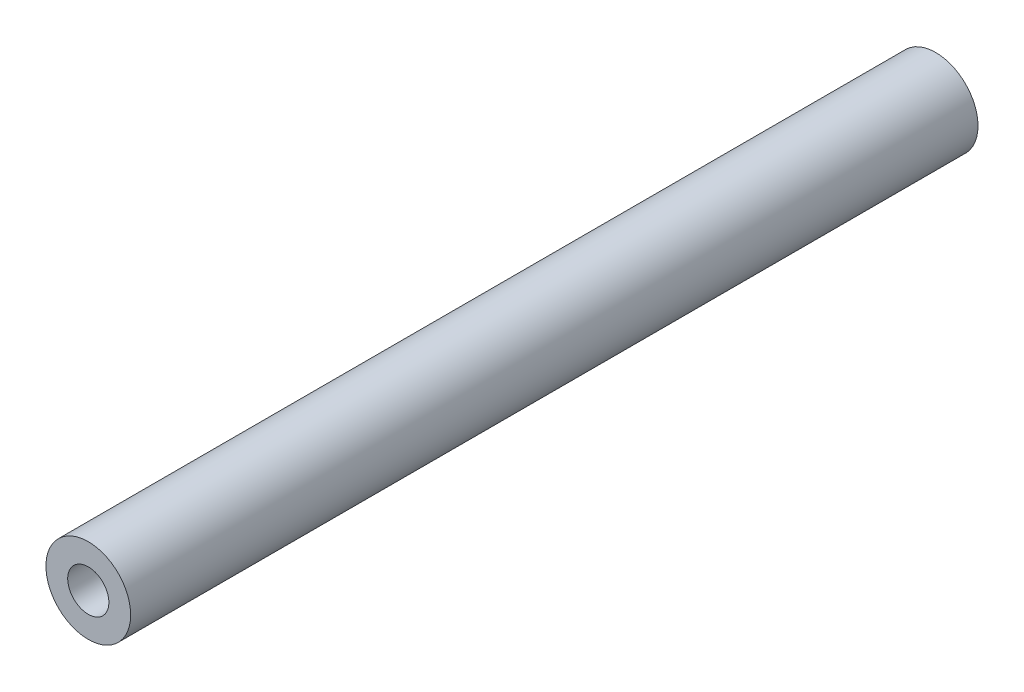
ISO-10303-21;
HEADER;
FILE_DESCRIPTION(('STEP AP214'),'2;1');
FILE_NAME('part.step','',(''),(''),'','','');
FILE_SCHEMA(('AUTOMOTIVE_DESIGN { 1 0 10303 214 1 1 1 1 }'));
ENDSEC;
DATA;
#1=APPLICATION_CONTEXT('core data for automotive mechanical design processes');
#2=APPLICATION_PROTOCOL_DEFINITION('international standard','automotive_design',2000,#1);
#3=PRODUCT_CONTEXT('',#1,'mechanical');
#4=PRODUCT('Part','Part','',(#3));
#5=PRODUCT_RELATED_PRODUCT_CATEGORY('part','',(#4));
#6=PRODUCT_DEFINITION_FORMATION('','',#4);
#7=PRODUCT_DEFINITION_CONTEXT('part definition',#1,'design');
#8=PRODUCT_DEFINITION('design','',#6,#7);
#9=PRODUCT_DEFINITION_SHAPE('','',#8);
#10=(LENGTH_UNIT() NAMED_UNIT(*) SI_UNIT(.MILLI.,.METRE.));
#11=(NAMED_UNIT(*) PLANE_ANGLE_UNIT() SI_UNIT($,.RADIAN.));
#12=(NAMED_UNIT(*) SI_UNIT($,.STERADIAN.) SOLID_ANGLE_UNIT());
#13=UNCERTAINTY_MEASURE_WITH_UNIT(LENGTH_MEASURE(1.E-05),#10,'distance_accuracy_value','');
#14=(GEOMETRIC_REPRESENTATION_CONTEXT(3) GLOBAL_UNCERTAINTY_ASSIGNED_CONTEXT((#13)) GLOBAL_UNIT_ASSIGNED_CONTEXT((#10,
#11,#12)) REPRESENTATION_CONTEXT('',''));
#15=CARTESIAN_POINT('',(0.,0.,0.));
#16=DIRECTION('',(0.,0.,1.));
#17=DIRECTION('',(1.,0.,0.));
#18=AXIS2_PLACEMENT_3D('',#15,#16,#17);
#19=CARTESIAN_POINT('',(169.638438212221,-7.2338261433673,70.));
#20=DIRECTION('',(0.,0.,1.));
#21=DIRECTION('',(1.,0.,0.));
#22=AXIS2_PLACEMENT_3D('',#19,#20,#21);
#23=PLANE('',#22);
#24=CARTESIAN_POINT('',(169.638438212221,-7.2338261433673,70.));
#25=DIRECTION('',(0.,0.,1.));
#26=DIRECTION('',(1.,0.,0.));
#27=AXIS2_PLACEMENT_3D('',#24,#25,#26);
#28=CIRCLE('',#27,3.49999999999999);
#29=CARTESIAN_POINT('',(173.138438212221,-7.2338261433673,70.));
#30=VERTEX_POINT('',#29);
#31=EDGE_CURVE('E10',#30,#30,#28,.T.);
#32=ORIENTED_EDGE('',*,*,#31,.T.);
#33=EDGE_LOOP('',(#32));
#34=FACE_BOUND('',#33,.T.);
#35=CARTESIAN_POINT('',(169.638438212221,-7.2338261433673,70.));
#36=DIRECTION('',(0.,0.,1.));
#37=DIRECTION('',(1.,0.,0.));
#38=AXIS2_PLACEMENT_3D('',#35,#36,#37);
#39=CIRCLE('',#38,1.70000000000001);
#40=CARTESIAN_POINT('',(171.338438212221,-7.2338261433673,70.));
#41=VERTEX_POINT('',#40);
#42=EDGE_CURVE('E42',#41,#41,#39,.T.);
#43=ORIENTED_EDGE('',*,*,#42,.F.);
#44=EDGE_LOOP('',(#43));
#45=FACE_BOUND('',#44,.T.);
#46=ADVANCED_FACE('F31',(#34,#45),#23,.T.);
#47=CARTESIAN_POINT('',(169.638438212221,-7.2338261433673,0.));
#48=DIRECTION('',(0.,0.,1.));
#49=DIRECTION('',(1.,0.,0.));
#50=AXIS2_PLACEMENT_3D('',#47,#48,#49);
#51=PLANE('',#50);
#52=CARTESIAN_POINT('',(169.638438212221,-7.2338261433673,0.));
#53=DIRECTION('',(0.,0.,1.));
#54=DIRECTION('',(1.,0.,0.));
#55=AXIS2_PLACEMENT_3D('',#52,#53,#54);
#56=CIRCLE('',#55,3.49999999999999);
#57=CARTESIAN_POINT('',(173.138438212221,-7.2338261433673,0.));
#58=VERTEX_POINT('',#57);
#59=EDGE_CURVE('E35',#58,#58,#56,.T.);
#60=ORIENTED_EDGE('',*,*,#59,.F.);
#61=EDGE_LOOP('',(#60));
#62=FACE_BOUND('',#61,.T.);
#63=CARTESIAN_POINT('',(169.638438212221,-7.2338261433673,0.));
#64=DIRECTION('',(0.,0.,1.));
#65=DIRECTION('',(1.,0.,0.));
#66=AXIS2_PLACEMENT_3D('',#63,#64,#65);
#67=CIRCLE('',#66,1.70000000000001);
#68=CARTESIAN_POINT('',(171.338438212221,-7.2338261433673,0.));
#69=VERTEX_POINT('',#68);
#70=EDGE_CURVE('E44',#69,#69,#67,.T.);
#71=ORIENTED_EDGE('',*,*,#70,.T.);
#72=EDGE_LOOP('',(#71));
#73=FACE_BOUND('',#72,.T.);
#74=ADVANCED_FACE('F54',(#62,#73),#51,.F.);
#75=CARTESIAN_POINT('',(169.638438212221,-7.2338261433673,70.));
#76=DIRECTION('',(0.,0.,-1.));
#77=DIRECTION('',(-1.,0.,0.));
#78=AXIS2_PLACEMENT_3D('',#75,#76,#77);
#79=CYLINDRICAL_SURFACE('',#78,3.49999999999999);
#80=ORIENTED_EDGE('',*,*,#31,.F.);
#81=EDGE_LOOP('',(#80));
#82=FACE_BOUND('',#81,.T.);
#83=ORIENTED_EDGE('',*,*,#59,.T.);
#84=EDGE_LOOP('',(#83));
#85=FACE_BOUND('',#84,.T.);
#86=ADVANCED_FACE('F33',(#82,#85),#79,.T.);
#87=CARTESIAN_POINT('',(169.638438212221,-7.2338261433673,70.));
#88=DIRECTION('',(0.,0.,-1.));
#89=DIRECTION('',(-1.,0.,0.));
#90=AXIS2_PLACEMENT_3D('',#87,#88,#89);
#91=CYLINDRICAL_SURFACE('',#90,1.70000000000001);
#92=ORIENTED_EDGE('',*,*,#42,.T.);
#93=EDGE_LOOP('',(#92));
#94=FACE_BOUND('',#93,.T.);
#95=ORIENTED_EDGE('',*,*,#70,.F.);
#96=EDGE_LOOP('',(#95));
#97=FACE_BOUND('',#96,.T.);
#98=ADVANCED_FACE('F50',(#94,#97),#91,.F.);
#99=CLOSED_SHELL('',(#46,#74,#86,#98));
#100=MANIFOLD_SOLID_BREP('B2',#99);
#101=ADVANCED_BREP_SHAPE_REPRESENTATION('',(#18,#100),#14);
#102=SHAPE_DEFINITION_REPRESENTATION(#9,#101);
ENDSEC;
END-ISO-10303-21;
